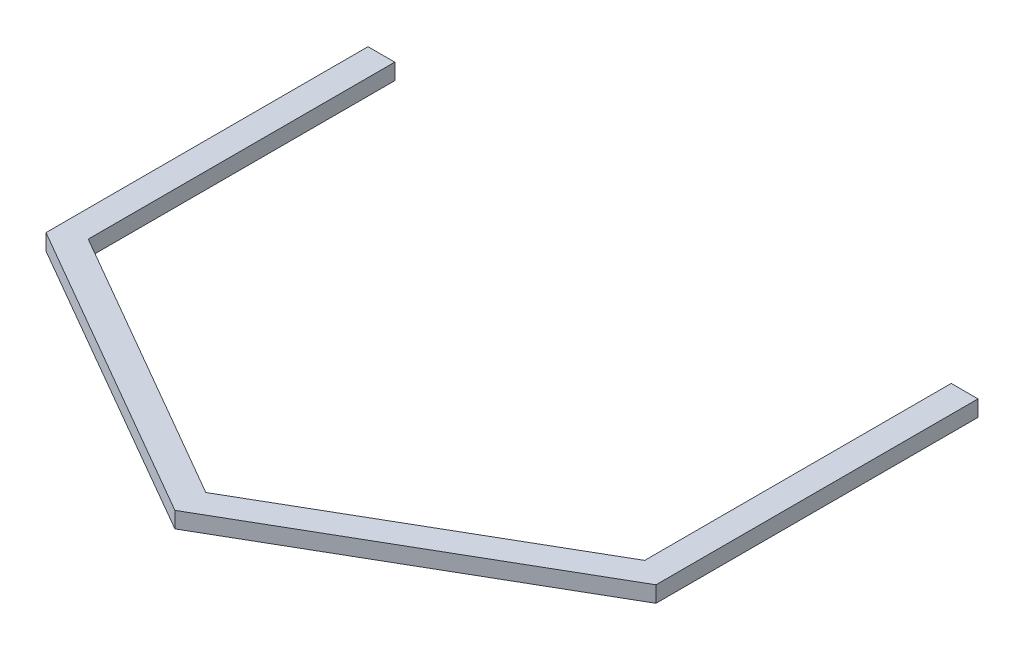
ISO-10303-21;
HEADER;
FILE_DESCRIPTION(('STEP AP214'),'2;1');
FILE_NAME('part.step','',(''),(''),'','','');
FILE_SCHEMA(('AUTOMOTIVE_DESIGN { 1 0 10303 214 1 1 1 1 }'));
ENDSEC;
DATA;
#1=APPLICATION_CONTEXT('core data for automotive mechanical design processes');
#2=APPLICATION_PROTOCOL_DEFINITION('international standard','automotive_design',2000,#1);
#3=PRODUCT_CONTEXT('',#1,'mechanical');
#4=PRODUCT('Part','Part','',(#3));
#5=PRODUCT_RELATED_PRODUCT_CATEGORY('part','',(#4));
#6=PRODUCT_DEFINITION_FORMATION('','',#4);
#7=PRODUCT_DEFINITION_CONTEXT('part definition',#1,'design');
#8=PRODUCT_DEFINITION('design','',#6,#7);
#9=PRODUCT_DEFINITION_SHAPE('','',#8);
#10=(LENGTH_UNIT() NAMED_UNIT(*) SI_UNIT(.MILLI.,.METRE.));
#11=(NAMED_UNIT(*) PLANE_ANGLE_UNIT() SI_UNIT($,.RADIAN.));
#12=(NAMED_UNIT(*) SI_UNIT($,.STERADIAN.) SOLID_ANGLE_UNIT());
#13=UNCERTAINTY_MEASURE_WITH_UNIT(LENGTH_MEASURE(1.E-05),#10,'distance_accuracy_value','');
#14=(GEOMETRIC_REPRESENTATION_CONTEXT(3) GLOBAL_UNCERTAINTY_ASSIGNED_CONTEXT((#13)) GLOBAL_UNIT_ASSIGNED_CONTEXT((#10,
#11,#12)) REPRESENTATION_CONTEXT('',''));
#15=CARTESIAN_POINT('',(0.,0.,0.));
#16=DIRECTION('',(0.,0.,1.));
#17=DIRECTION('',(1.,0.,0.));
#18=AXIS2_PLACEMENT_3D('',#15,#16,#17);
#19=CARTESIAN_POINT('',(-71.9615242270662,-8.99999999999997,-27.26));
#20=DIRECTION('',(0.,-1.,0.));
#21=DIRECTION('',(0.,0.,-1.));
#22=AXIS2_PLACEMENT_3D('',#19,#20,#21);
#23=PLANE('',#22);
#24=DIRECTION('',(0.866025403784439,0.,0.5));
#25=VECTOR('',#24,1.);
#26=CARTESIAN_POINT('',(-28.4807621135332,-9.,49.3301270189222));
#27=LINE('',#26,#25);
#28=CARTESIAN_POINT('',(-56.9615242270663,-9.,32.8867513459481));
#29=VERTEX_POINT('',#28);
#30=CARTESIAN_POINT('',(0.,-8.99999999999997,65.7735026918963));
#31=VERTEX_POINT('',#30);
#32=EDGE_CURVE('E56',#29,#31,#27,.T.);
#33=ORIENTED_EDGE('',*,*,#32,.F.);
#34=DIRECTION('',(0.,0.,1.));
#35=VECTOR('',#34,1.);
#36=CARTESIAN_POINT('',(-56.9615242270663,-9.,0.));
#37=LINE('',#36,#35);
#38=CARTESIAN_POINT('',(-56.9615242270663,-9.,-27.25));
#39=VERTEX_POINT('',#38);
#40=EDGE_CURVE('E173',#39,#29,#37,.T.);
#41=ORIENTED_EDGE('',*,*,#40,.F.);
#42=DIRECTION('',(1.,0.,0.));
#43=VECTOR('',#42,1.);
#44=CARTESIAN_POINT('',(-113.272742430532,-8.99999999999997,-27.25));
#45=LINE('',#44,#43);
#46=CARTESIAN_POINT('',(-51.9615242270664,-8.99999999999997,-27.25));
#47=VERTEX_POINT('',#46);
#48=EDGE_CURVE('E11',#39,#47,#45,.T.);
#49=ORIENTED_EDGE('',*,*,#48,.T.);
#50=DIRECTION('',(0.,0.,-1.));
#51=VECTOR('',#50,1.);
#52=CARTESIAN_POINT('',(-51.9615242270664,-8.99999999999997,0.));
#53=LINE('',#52,#51);
#54=CARTESIAN_POINT('',(-51.9615242270663,-8.99999999999997,29.9999999999999));
#55=VERTEX_POINT('',#54);
#56=EDGE_CURVE('E196',#55,#47,#53,.T.);
#57=ORIENTED_EDGE('',*,*,#56,.F.);
#58=DIRECTION('',(-0.866025403784439,0.,-0.5));
#59=VECTOR('',#58,1.);
#60=CARTESIAN_POINT('',(-25.9807621135331,-8.99999999999997,44.9999999999999));
#61=LINE('',#60,#59);
#62=CARTESIAN_POINT('',(0.,-8.99999999999997,59.9999999999999));
#63=VERTEX_POINT('',#62);
#64=EDGE_CURVE('E128',#63,#55,#61,.T.);
#65=ORIENTED_EDGE('',*,*,#64,.F.);
#66=DIRECTION('',(-0.866025403784439,0.,0.5));
#67=VECTOR('',#66,1.);
#68=CARTESIAN_POINT('',(25.9807621135331,-8.99999999999997,44.9999999999999));
#69=LINE('',#68,#67);
#70=CARTESIAN_POINT('',(51.9615242270664,-8.99999999999997,29.9999999999998));
#71=VERTEX_POINT('',#70);
#72=EDGE_CURVE('E188',#71,#63,#69,.T.);
#73=ORIENTED_EDGE('',*,*,#72,.F.);
#74=DIRECTION('',(0.,0.,1.));
#75=VECTOR('',#74,1.);
#76=CARTESIAN_POINT('',(51.9615242270663,-8.99999999999997,-1.8027775184846E-13));
#77=LINE('',#76,#75);
#78=CARTESIAN_POINT('',(51.9615242270662,-8.99999999999997,-27.25));
#79=VERTEX_POINT('',#78);
#80=EDGE_CURVE('E64',#79,#71,#77,.T.);
#81=ORIENTED_EDGE('',*,*,#80,.F.);
#82=DIRECTION('',(1.,0.,0.));
#83=VECTOR('',#82,1.);
#84=CARTESIAN_POINT('',(-113.272742430532,-8.99999999999997,-27.25));
#85=LINE('',#84,#83);
#86=CARTESIAN_POINT('',(56.9615242270663,-9.,-27.25));
#87=VERTEX_POINT('',#86);
#88=EDGE_CURVE('E49',#79,#87,#85,.T.);
#89=ORIENTED_EDGE('',*,*,#88,.T.);
#90=DIRECTION('',(0.,0.,-1.));
#91=VECTOR('',#90,1.);
#92=CARTESIAN_POINT('',(56.9615242270663,-9.,0.));
#93=LINE('',#92,#91);
#94=CARTESIAN_POINT('',(56.9615242270663,-9.,32.8867513459481));
#95=VERTEX_POINT('',#94);
#96=EDGE_CURVE('E178',#95,#87,#93,.T.);
#97=ORIENTED_EDGE('',*,*,#96,.F.);
#98=DIRECTION('',(0.866025403784439,0.,-0.5));
#99=VECTOR('',#98,1.);
#100=CARTESIAN_POINT('',(28.4807621135332,-9.,49.3301270189222));
#101=LINE('',#100,#99);
#102=EDGE_CURVE('E174',#31,#95,#101,.T.);
#103=ORIENTED_EDGE('',*,*,#102,.F.);
#104=EDGE_LOOP('',(#33,#41,#49,#57,#65,#73,#81,#89,#97,#103));
#105=FACE_BOUND('',#104,.T.);
#106=ADVANCED_FACE('F42',(#105),#23,.T.);
#107=CARTESIAN_POINT('',(0.,-6.,0.));
#108=DIRECTION('',(0.,1.,0.));
#109=DIRECTION('',(0.,0.,1.));
#110=AXIS2_PLACEMENT_3D('',#107,#108,#109);
#111=PLANE('',#110);
#112=DIRECTION('',(1.,0.,0.));
#113=VECTOR('',#112,1.);
#114=CARTESIAN_POINT('',(0.,-6.,-27.25));
#115=LINE('',#114,#113);
#116=CARTESIAN_POINT('',(-56.9615242270663,-6.,-27.25));
#117=VERTEX_POINT('',#116);
#118=CARTESIAN_POINT('',(-51.9615242270664,-6.,-27.25));
#119=VERTEX_POINT('',#118);
#120=EDGE_CURVE('E183',#117,#119,#115,.T.);
#121=ORIENTED_EDGE('',*,*,#120,.F.);
#122=DIRECTION('',(0.,0.,1.));
#123=VECTOR('',#122,1.);
#124=CARTESIAN_POINT('',(-56.9615242270663,-6.,-32.8867513459481));
#125=LINE('',#124,#123);
#126=CARTESIAN_POINT('',(-56.9615242270663,-6.,32.8867513459481));
#127=VERTEX_POINT('',#126);
#128=EDGE_CURVE('E157',#117,#127,#125,.T.);
#129=ORIENTED_EDGE('',*,*,#128,.T.);
#130=DIRECTION('',(0.866025403784439,0.,0.5));
#131=VECTOR('',#130,1.);
#132=CARTESIAN_POINT('',(-56.9615242270663,-6.,32.8867513459481));
#133=LINE('',#132,#131);
#134=CARTESIAN_POINT('',(0.,-6.,65.7735026918963));
#135=VERTEX_POINT('',#134);
#136=EDGE_CURVE('E159',#127,#135,#133,.T.);
#137=ORIENTED_EDGE('',*,*,#136,.T.);
#138=DIRECTION('',(0.866025403784439,0.,-0.5));
#139=VECTOR('',#138,1.);
#140=CARTESIAN_POINT('',(0.,-6.,65.7735026918963));
#141=LINE('',#140,#139);
#142=CARTESIAN_POINT('',(56.9615242270663,-6.,32.8867513459481));
#143=VERTEX_POINT('',#142);
#144=EDGE_CURVE('E151',#135,#143,#141,.T.);
#145=ORIENTED_EDGE('',*,*,#144,.T.);
#146=DIRECTION('',(0.,0.,-1.));
#147=VECTOR('',#146,1.);
#148=CARTESIAN_POINT('',(56.9615242270663,-6.,32.8867513459481));
#149=LINE('',#148,#147);
#150=CARTESIAN_POINT('',(56.9615242270663,-6.,-27.25));
#151=VERTEX_POINT('',#150);
#152=EDGE_CURVE('E154',#143,#151,#149,.T.);
#153=ORIENTED_EDGE('',*,*,#152,.T.);
#154=CARTESIAN_POINT('',(51.9615242270662,-6.,-27.25));
#155=VERTEX_POINT('',#154);
#156=EDGE_CURVE('E185',#155,#151,#115,.T.);
#157=ORIENTED_EDGE('',*,*,#156,.F.);
#158=DIRECTION('',(0.,0.,-1.));
#159=VECTOR('',#158,1.);
#160=CARTESIAN_POINT('',(51.9615242270664,-6.,29.9999999999998));
#161=LINE('',#160,#159);
#162=CARTESIAN_POINT('',(51.9615242270664,-6.,29.9999999999998));
#163=VERTEX_POINT('',#162);
#164=EDGE_CURVE('E146',#163,#155,#161,.T.);
#165=ORIENTED_EDGE('',*,*,#164,.F.);
#166=DIRECTION('',(0.866025403784439,0.,-0.5));
#167=VECTOR('',#166,1.);
#168=CARTESIAN_POINT('',(0.,-6.,59.9999999999999));
#169=LINE('',#168,#167);
#170=CARTESIAN_POINT('',(0.,-6.,59.9999999999999));
#171=VERTEX_POINT('',#170);
#172=EDGE_CURVE('E144',#171,#163,#169,.T.);
#173=ORIENTED_EDGE('',*,*,#172,.F.);
#174=DIRECTION('',(0.866025403784439,0.,0.5));
#175=VECTOR('',#174,1.);
#176=CARTESIAN_POINT('',(-51.9615242270663,-6.,29.9999999999999));
#177=LINE('',#176,#175);
#178=CARTESIAN_POINT('',(-51.9615242270663,-6.,29.9999999999999));
#179=VERTEX_POINT('',#178);
#180=EDGE_CURVE('E125',#179,#171,#177,.T.);
#181=ORIENTED_EDGE('',*,*,#180,.F.);
#182=DIRECTION('',(0.,0.,1.));
#183=VECTOR('',#182,1.);
#184=CARTESIAN_POINT('',(-51.9615242270664,-6.,-29.9999999999999));
#185=LINE('',#184,#183);
#186=EDGE_CURVE('E134',#119,#179,#185,.T.);
#187=ORIENTED_EDGE('',*,*,#186,.F.);
#188=EDGE_LOOP('',(#121,#129,#137,#145,#153,#157,#165,#173,#181,#187));
#189=FACE_BOUND('',#188,.T.);
#190=ADVANCED_FACE('F141',(#189),#111,.T.);
#191=CARTESIAN_POINT('',(-56.9615242270663,-12.,0.));
#192=DIRECTION('',(1.,0.,0.));
#193=DIRECTION('',(0.,0.,-1.));
#194=AXIS2_PLACEMENT_3D('',#191,#192,#193);
#195=PLANE('',#194);
#196=DIRECTION('',(0.,-1.,0.));
#197=VECTOR('',#196,1.);
#198=CARTESIAN_POINT('',(-56.9615242270663,-12.,-27.25));
#199=LINE('',#198,#197);
#200=EDGE_CURVE('E189',#117,#39,#199,.T.);
#201=ORIENTED_EDGE('',*,*,#200,.T.);
#202=ORIENTED_EDGE('',*,*,#40,.T.);
#203=DIRECTION('',(0.,-1.,0.));
#204=VECTOR('',#203,1.);
#205=CARTESIAN_POINT('',(-56.9615242270663,-6.,32.8867513459481));
#206=LINE('',#205,#204);
#207=EDGE_CURVE('E164',#127,#29,#206,.T.);
#208=ORIENTED_EDGE('',*,*,#207,.F.);
#209=ORIENTED_EDGE('',*,*,#128,.F.);
#210=EDGE_LOOP('',(#201,#202,#208,#209));
#211=FACE_BOUND('',#210,.T.);
#212=ADVANCED_FACE('F206',(#211),#195,.F.);
#213=CARTESIAN_POINT('',(-28.4807621135347,-12.,49.3301270189249));
#214=DIRECTION('',(0.5,0.,-0.866025403784438));
#215=DIRECTION('',(-0.866025403784439,0.,-0.5));
#216=AXIS2_PLACEMENT_3D('',#213,#214,#215);
#217=PLANE('',#216);
#218=ORIENTED_EDGE('',*,*,#32,.T.);
#219=DIRECTION('',(0.,-1.,0.));
#220=VECTOR('',#219,1.);
#221=CARTESIAN_POINT('',(0.,-6.,65.7735026918963));
#222=LINE('',#221,#220);
#223=EDGE_CURVE('E161',#135,#31,#222,.T.);
#224=ORIENTED_EDGE('',*,*,#223,.F.);
#225=ORIENTED_EDGE('',*,*,#136,.F.);
#226=ORIENTED_EDGE('',*,*,#207,.T.);
#227=EDGE_LOOP('',(#218,#224,#225,#226));
#228=FACE_BOUND('',#227,.T.);
#229=ADVANCED_FACE('F207',(#228),#217,.F.);
#230=CARTESIAN_POINT('',(28.480762113535,-12.,49.3301270189254));
#231=DIRECTION('',(-0.5,0.,-0.866025403784439));
#232=DIRECTION('',(-0.866025403784439,0.,0.5));
#233=AXIS2_PLACEMENT_3D('',#230,#231,#232);
#234=PLANE('',#233);
#235=ORIENTED_EDGE('',*,*,#223,.T.);
#236=ORIENTED_EDGE('',*,*,#102,.T.);
#237=DIRECTION('',(0.,-1.,0.));
#238=VECTOR('',#237,1.);
#239=CARTESIAN_POINT('',(56.9615242270663,-6.,32.8867513459481));
#240=LINE('',#239,#238);
#241=EDGE_CURVE('E166',#143,#95,#240,.T.);
#242=ORIENTED_EDGE('',*,*,#241,.F.);
#243=ORIENTED_EDGE('',*,*,#144,.F.);
#244=EDGE_LOOP('',(#235,#236,#242,#243));
#245=FACE_BOUND('',#244,.T.);
#246=ADVANCED_FACE('F211',(#245),#234,.F.);
#247=CARTESIAN_POINT('',(56.9615242270675,-12.,0.));
#248=DIRECTION('',(-1.,0.,0.));
#249=DIRECTION('',(0.,0.,1.));
#250=AXIS2_PLACEMENT_3D('',#247,#248,#249);
#251=PLANE('',#250);
#252=ORIENTED_EDGE('',*,*,#241,.T.);
#253=ORIENTED_EDGE('',*,*,#96,.T.);
#254=DIRECTION('',(0.,1.,0.));
#255=VECTOR('',#254,1.);
#256=CARTESIAN_POINT('',(56.9615242270675,-12.,-27.25));
#257=LINE('',#256,#255);
#258=EDGE_CURVE('E177',#87,#151,#257,.T.);
#259=ORIENTED_EDGE('',*,*,#258,.T.);
#260=ORIENTED_EDGE('',*,*,#152,.F.);
#261=EDGE_LOOP('',(#252,#253,#259,#260));
#262=FACE_BOUND('',#261,.T.);
#263=ADVANCED_FACE('F214',(#262),#251,.F.);
#264=CARTESIAN_POINT('',(-113.272742430532,-42.01,-27.25));
#265=DIRECTION('',(0.,0.,1.));
#266=DIRECTION('',(1.,0.,0.));
#267=AXIS2_PLACEMENT_3D('',#264,#265,#266);
#268=PLANE('',#267);
#269=ORIENTED_EDGE('',*,*,#88,.F.);
#270=DIRECTION('',(0.,1.,0.));
#271=VECTOR('',#270,1.);
#272=CARTESIAN_POINT('',(51.9615242270662,-12.,-27.25));
#273=LINE('',#272,#271);
#274=EDGE_CURVE('E184',#79,#155,#273,.T.);
#275=ORIENTED_EDGE('',*,*,#274,.T.);
#276=ORIENTED_EDGE('',*,*,#156,.T.);
#277=ORIENTED_EDGE('',*,*,#258,.F.);
#278=EDGE_LOOP('',(#269,#275,#276,#277));
#279=FACE_BOUND('',#278,.T.);
#280=ADVANCED_FACE('F217',(#279),#268,.F.);
#281=CARTESIAN_POINT('',(51.9615242270663,-12.,-1.8027775184846E-13));
#282=DIRECTION('',(-1.,0.,0.));
#283=DIRECTION('',(0.,0.,1.));
#284=AXIS2_PLACEMENT_3D('',#281,#282,#283);
#285=PLANE('',#284);
#286=ORIENTED_EDGE('',*,*,#274,.F.);
#287=ORIENTED_EDGE('',*,*,#80,.T.);
#288=DIRECTION('',(0.,1.,0.));
#289=VECTOR('',#288,1.);
#290=CARTESIAN_POINT('',(51.9615242270664,-12.,29.9999999999998));
#291=LINE('',#290,#289);
#292=EDGE_CURVE('E169',#71,#163,#291,.T.);
#293=ORIENTED_EDGE('',*,*,#292,.T.);
#294=ORIENTED_EDGE('',*,*,#164,.T.);
#295=EDGE_LOOP('',(#286,#287,#293,#294));
#296=FACE_BOUND('',#295,.T.);
#297=ADVANCED_FACE('F220',(#296),#285,.T.);
#298=CARTESIAN_POINT('',(25.9807621135331,-12.,44.9999999999999));
#299=DIRECTION('',(-0.5,0.,-0.866025403784439));
#300=DIRECTION('',(-0.866025403784439,0.,0.5));
#301=AXIS2_PLACEMENT_3D('',#298,#299,#300);
#302=PLANE('',#301);
#303=ORIENTED_EDGE('',*,*,#292,.F.);
#304=ORIENTED_EDGE('',*,*,#72,.T.);
#305=DIRECTION('',(0.,1.,0.));
#306=VECTOR('',#305,1.);
#307=CARTESIAN_POINT('',(0.,-12.,59.9999999999999));
#308=LINE('',#307,#306);
#309=EDGE_CURVE('E131',#63,#171,#308,.T.);
#310=ORIENTED_EDGE('',*,*,#309,.T.);
#311=ORIENTED_EDGE('',*,*,#172,.T.);
#312=EDGE_LOOP('',(#303,#304,#310,#311));
#313=FACE_BOUND('',#312,.T.);
#314=ADVANCED_FACE('F223',(#313),#302,.T.);
#315=ORIENTED_EDGE('',*,*,#48,.F.);
#316=ORIENTED_EDGE('',*,*,#200,.F.);
#317=ORIENTED_EDGE('',*,*,#120,.T.);
#318=DIRECTION('',(0.,-1.,0.));
#319=VECTOR('',#318,1.);
#320=CARTESIAN_POINT('',(-51.9615242270664,-12.,-27.25));
#321=LINE('',#320,#319);
#322=EDGE_CURVE('E137',#119,#47,#321,.T.);
#323=ORIENTED_EDGE('',*,*,#322,.T.);
#324=EDGE_LOOP('',(#315,#316,#317,#323));
#325=FACE_BOUND('',#324,.T.);
#326=ADVANCED_FACE('F201',(#325),#268,.F.);
#327=CARTESIAN_POINT('',(-25.9807621135331,-12.,44.9999999999999));
#328=DIRECTION('',(0.5,0.,-0.866025403784439));
#329=DIRECTION('',(-0.866025403784439,0.,-0.5));
#330=AXIS2_PLACEMENT_3D('',#327,#328,#329);
#331=PLANE('',#330);
#332=ORIENTED_EDGE('',*,*,#309,.F.);
#333=ORIENTED_EDGE('',*,*,#64,.T.);
#334=DIRECTION('',(0.,1.,0.));
#335=VECTOR('',#334,1.);
#336=CARTESIAN_POINT('',(-51.9615242270663,-12.,29.9999999999999));
#337=LINE('',#336,#335);
#338=EDGE_CURVE('E120',#55,#179,#337,.T.);
#339=ORIENTED_EDGE('',*,*,#338,.T.);
#340=ORIENTED_EDGE('',*,*,#180,.T.);
#341=EDGE_LOOP('',(#332,#333,#339,#340));
#342=FACE_BOUND('',#341,.T.);
#343=ADVANCED_FACE('F123',(#342),#331,.T.);
#344=CARTESIAN_POINT('',(-51.9615242270664,-12.,0.));
#345=DIRECTION('',(1.,0.,0.));
#346=DIRECTION('',(0.,0.,-1.));
#347=AXIS2_PLACEMENT_3D('',#344,#345,#346);
#348=PLANE('',#347);
#349=ORIENTED_EDGE('',*,*,#338,.F.);
#350=ORIENTED_EDGE('',*,*,#56,.T.);
#351=ORIENTED_EDGE('',*,*,#322,.F.);
#352=ORIENTED_EDGE('',*,*,#186,.T.);
#353=EDGE_LOOP('',(#349,#350,#351,#352));
#354=FACE_BOUND('',#353,.T.);
#355=ADVANCED_FACE('F135',(#354),#348,.T.);
#356=CLOSED_SHELL('',(#106,#190,#212,#229,#246,#263,#280,#297,#314,#326,#343,#355));
#357=MANIFOLD_SOLID_BREP('B2',#356);
#358=ADVANCED_BREP_SHAPE_REPRESENTATION('',(#18,#357),#14);
#359=SHAPE_DEFINITION_REPRESENTATION(#9,#358);
ENDSEC;
END-ISO-10303-21;
